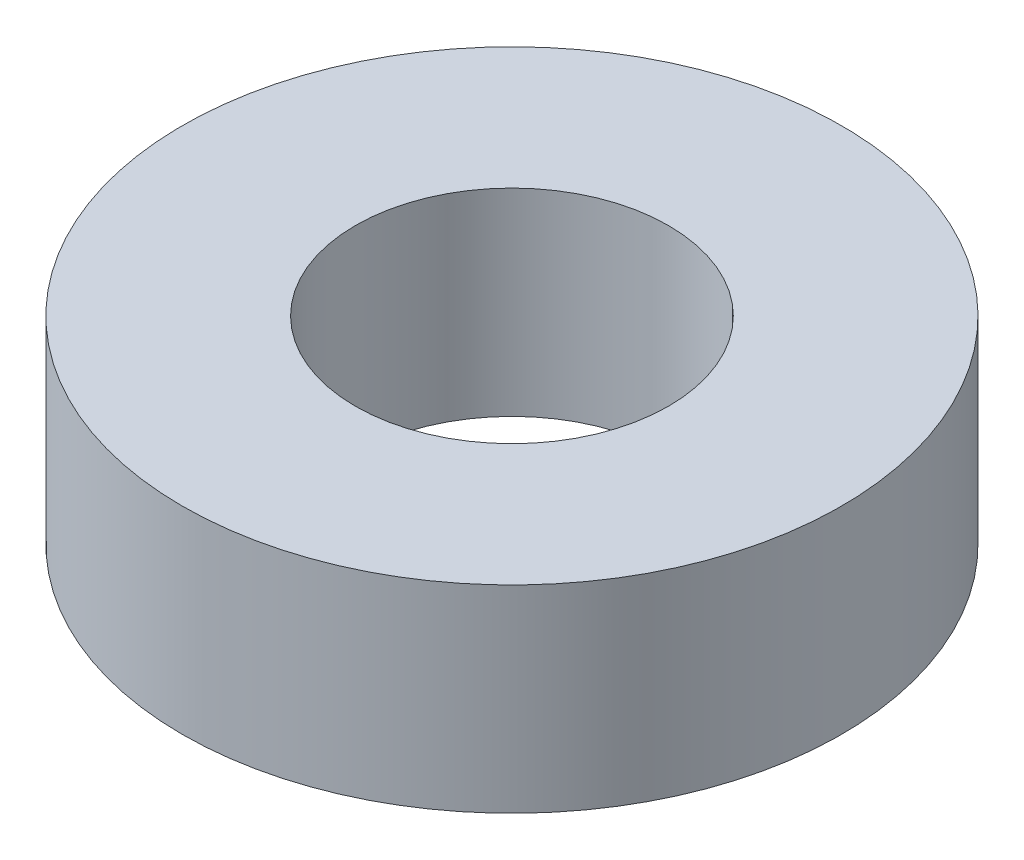
ISO-10303-21;
HEADER;
FILE_DESCRIPTION(('STEP AP214'),'2;1');
FILE_NAME('part.step','',(''),(''),'','','');
FILE_SCHEMA(('AUTOMOTIVE_DESIGN { 1 0 10303 214 1 1 1 1 }'));
ENDSEC;
DATA;
#1=APPLICATION_CONTEXT('core data for automotive mechanical design processes');
#2=APPLICATION_PROTOCOL_DEFINITION('international standard','automotive_design',2000,#1);
#3=PRODUCT_CONTEXT('',#1,'mechanical');
#4=PRODUCT('Part','Part','',(#3));
#5=PRODUCT_RELATED_PRODUCT_CATEGORY('part','',(#4));
#6=PRODUCT_DEFINITION_FORMATION('','',#4);
#7=PRODUCT_DEFINITION_CONTEXT('part definition',#1,'design');
#8=PRODUCT_DEFINITION('design','',#6,#7);
#9=PRODUCT_DEFINITION_SHAPE('','',#8);
#10=(LENGTH_UNIT() NAMED_UNIT(*) SI_UNIT(.MILLI.,.METRE.));
#11=(NAMED_UNIT(*) PLANE_ANGLE_UNIT() SI_UNIT($,.RADIAN.));
#12=(NAMED_UNIT(*) SI_UNIT($,.STERADIAN.) SOLID_ANGLE_UNIT());
#13=UNCERTAINTY_MEASURE_WITH_UNIT(LENGTH_MEASURE(1.E-05),#10,'distance_accuracy_value','');
#14=(GEOMETRIC_REPRESENTATION_CONTEXT(3) GLOBAL_UNCERTAINTY_ASSIGNED_CONTEXT((#13)) GLOBAL_UNIT_ASSIGNED_CONTEXT((#10,
#11,#12)) REPRESENTATION_CONTEXT('',''));
#15=CARTESIAN_POINT('',(0.,0.,0.));
#16=DIRECTION('',(0.,0.,1.));
#17=DIRECTION('',(1.,0.,0.));
#18=AXIS2_PLACEMENT_3D('',#15,#16,#17);
#19=CARTESIAN_POINT('',(0.,3.,0.));
#20=DIRECTION('',(0.,1.,0.));
#21=DIRECTION('',(0.,0.,1.));
#22=AXIS2_PLACEMENT_3D('',#19,#20,#21);
#23=PLANE('',#22);
#24=CARTESIAN_POINT('',(0.,3.,0.));
#25=DIRECTION('',(0.,1.,0.));
#26=DIRECTION('',(0.,0.,1.));
#27=AXIS2_PLACEMENT_3D('',#24,#25,#26);
#28=CIRCLE('',#27,5.);
#29=CARTESIAN_POINT('',(0.,3.,5.));
#30=VERTEX_POINT('',#29);
#31=EDGE_CURVE('E10',#30,#30,#28,.T.);
#32=ORIENTED_EDGE('',*,*,#31,.T.);
#33=EDGE_LOOP('',(#32));
#34=FACE_BOUND('',#33,.T.);
#35=CARTESIAN_POINT('',(0.,3.,0.));
#36=DIRECTION('',(0.,1.,0.));
#37=DIRECTION('',(0.,0.,1.));
#38=AXIS2_PLACEMENT_3D('',#35,#36,#37);
#39=CIRCLE('',#38,2.375);
#40=CARTESIAN_POINT('',(0.,3.,2.375));
#41=VERTEX_POINT('',#40);
#42=EDGE_CURVE('E45',#41,#41,#39,.T.);
#43=ORIENTED_EDGE('',*,*,#42,.F.);
#44=EDGE_LOOP('',(#43));
#45=FACE_BOUND('',#44,.T.);
#46=ADVANCED_FACE('F34',(#34,#45),#23,.T.);
#47=CARTESIAN_POINT('',(0.,0.,0.));
#48=DIRECTION('',(0.,1.,0.));
#49=DIRECTION('',(0.,0.,1.));
#50=AXIS2_PLACEMENT_3D('',#47,#48,#49);
#51=PLANE('',#50);
#52=CARTESIAN_POINT('',(0.,0.,0.));
#53=DIRECTION('',(0.,1.,0.));
#54=DIRECTION('',(0.,0.,1.));
#55=AXIS2_PLACEMENT_3D('',#52,#53,#54);
#56=CIRCLE('',#55,5.);
#57=CARTESIAN_POINT('',(0.,0.,5.));
#58=VERTEX_POINT('',#57);
#59=EDGE_CURVE('E38',#58,#58,#56,.T.);
#60=ORIENTED_EDGE('',*,*,#59,.F.);
#61=EDGE_LOOP('',(#60));
#62=FACE_BOUND('',#61,.T.);
#63=CARTESIAN_POINT('',(0.,0.,0.));
#64=DIRECTION('',(0.,1.,0.));
#65=DIRECTION('',(0.,0.,1.));
#66=AXIS2_PLACEMENT_3D('',#63,#64,#65);
#67=CIRCLE('',#66,2.375);
#68=CARTESIAN_POINT('',(0.,0.,2.375));
#69=VERTEX_POINT('',#68);
#70=EDGE_CURVE('E47',#69,#69,#67,.T.);
#71=ORIENTED_EDGE('',*,*,#70,.T.);
#72=EDGE_LOOP('',(#71));
#73=FACE_BOUND('',#72,.T.);
#74=ADVANCED_FACE('F57',(#62,#73),#51,.F.);
#75=CARTESIAN_POINT('',(0.,3.,0.));
#76=DIRECTION('',(0.,-1.,0.));
#77=DIRECTION('',(0.,0.,-1.));
#78=AXIS2_PLACEMENT_3D('',#75,#76,#77);
#79=CYLINDRICAL_SURFACE('',#78,5.);
#80=ORIENTED_EDGE('',*,*,#31,.F.);
#81=EDGE_LOOP('',(#80));
#82=FACE_BOUND('',#81,.T.);
#83=ORIENTED_EDGE('',*,*,#59,.T.);
#84=EDGE_LOOP('',(#83));
#85=FACE_BOUND('',#84,.T.);
#86=ADVANCED_FACE('F36',(#82,#85),#79,.T.);
#87=CARTESIAN_POINT('',(0.,3.,0.));
#88=DIRECTION('',(0.,-1.,0.));
#89=DIRECTION('',(0.,0.,-1.));
#90=AXIS2_PLACEMENT_3D('',#87,#88,#89);
#91=CYLINDRICAL_SURFACE('',#90,2.375);
#92=ORIENTED_EDGE('',*,*,#42,.T.);
#93=EDGE_LOOP('',(#92));
#94=FACE_BOUND('',#93,.T.);
#95=ORIENTED_EDGE('',*,*,#70,.F.);
#96=EDGE_LOOP('',(#95));
#97=FACE_BOUND('',#96,.T.);
#98=ADVANCED_FACE('F53',(#94,#97),#91,.F.);
#99=CLOSED_SHELL('',(#46,#74,#86,#98));
#100=MANIFOLD_SOLID_BREP('B2',#99);
#101=ADVANCED_BREP_SHAPE_REPRESENTATION('',(#18,#100),#14);
#102=SHAPE_DEFINITION_REPRESENTATION(#9,#101);
ENDSEC;
END-ISO-10303-21;
